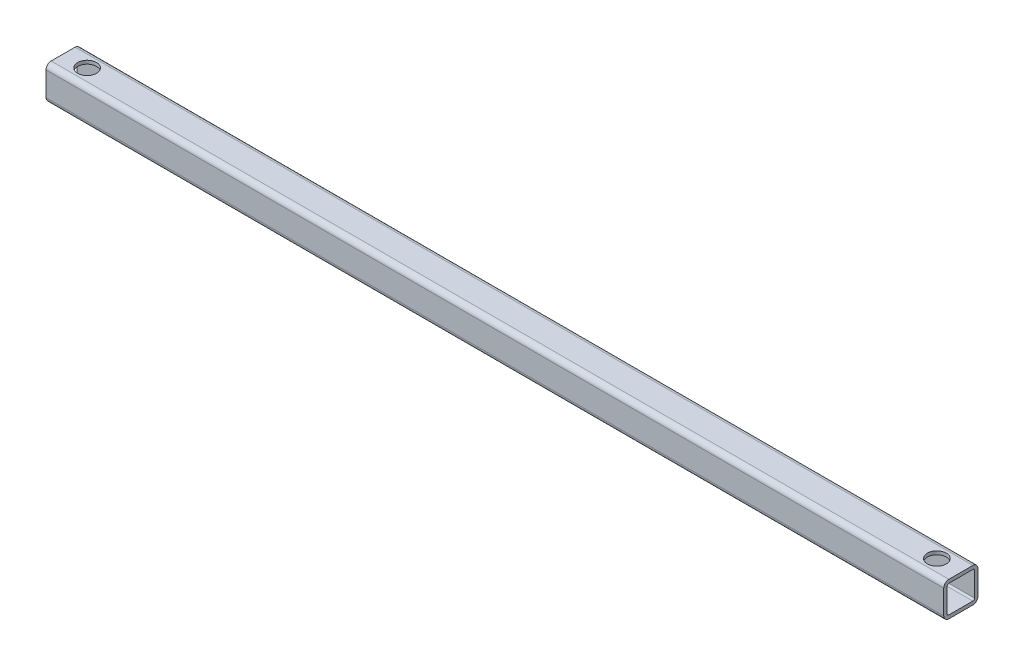
ISO-10303-21;
HEADER;
FILE_DESCRIPTION(('STEP AP214'),'2;1');
FILE_NAME('part.step','',(''),(''),'','','');
FILE_SCHEMA(('AUTOMOTIVE_DESIGN { 1 0 10303 214 1 1 1 1 }'));
ENDSEC;
DATA;
#1=APPLICATION_CONTEXT('core data for automotive mechanical design processes');
#2=APPLICATION_PROTOCOL_DEFINITION('international standard','automotive_design',2000,#1);
#3=PRODUCT_CONTEXT('',#1,'mechanical');
#4=PRODUCT('Part','Part','',(#3));
#5=PRODUCT_RELATED_PRODUCT_CATEGORY('part','',(#4));
#6=PRODUCT_DEFINITION_FORMATION('','',#4);
#7=PRODUCT_DEFINITION_CONTEXT('part definition',#1,'design');
#8=PRODUCT_DEFINITION('design','',#6,#7);
#9=PRODUCT_DEFINITION_SHAPE('','',#8);
#10=(LENGTH_UNIT() NAMED_UNIT(*) SI_UNIT(.MILLI.,.METRE.));
#11=(NAMED_UNIT(*) PLANE_ANGLE_UNIT() SI_UNIT($,.RADIAN.));
#12=(NAMED_UNIT(*) SI_UNIT($,.STERADIAN.) SOLID_ANGLE_UNIT());
#13=UNCERTAINTY_MEASURE_WITH_UNIT(LENGTH_MEASURE(1.E-05),#10,'distance_accuracy_value','');
#14=(GEOMETRIC_REPRESENTATION_CONTEXT(3) GLOBAL_UNCERTAINTY_ASSIGNED_CONTEXT((#13)) GLOBAL_UNIT_ASSIGNED_CONTEXT((#10,
#11,#12)) REPRESENTATION_CONTEXT('',''));
#15=CARTESIAN_POINT('',(0.,0.,0.));
#16=DIRECTION('',(0.,0.,1.));
#17=DIRECTION('',(1.,0.,0.));
#18=AXIS2_PLACEMENT_3D('',#15,#16,#17);
#19=CARTESIAN_POINT('',(262.,7.,7.));
#20=DIRECTION('',(-1.,0.,0.));
#21=DIRECTION('',(0.,0.,1.));
#22=AXIS2_PLACEMENT_3D('',#19,#20,#21);
#23=CYLINDRICAL_SURFACE('',#22,3.);
#24=CARTESIAN_POINT('',(-262.,7.,7.));
#25=DIRECTION('',(1.,0.,0.));
#26=DIRECTION('',(0.,0.,-1.));
#27=AXIS2_PLACEMENT_3D('',#24,#25,#26);
#28=CIRCLE('',#27,3.);
#29=CARTESIAN_POINT('',(-262.,10.,7.));
#30=VERTEX_POINT('',#29);
#31=CARTESIAN_POINT('',(-262.,7.,10.));
#32=VERTEX_POINT('',#31);
#33=EDGE_CURVE('E255',#30,#32,#28,.T.);
#34=ORIENTED_EDGE('',*,*,#33,.T.);
#35=DIRECTION('',(-1.,0.,0.));
#36=VECTOR('',#35,1.);
#37=CARTESIAN_POINT('',(262.,7.,10.));
#38=LINE('',#37,#36);
#39=CARTESIAN_POINT('',(262.,7.,10.));
#40=VERTEX_POINT('',#39);
#41=EDGE_CURVE('E12',#40,#32,#38,.T.);
#42=ORIENTED_EDGE('',*,*,#41,.F.);
#43=CARTESIAN_POINT('',(262.,7.,7.));
#44=DIRECTION('',(1.,0.,0.));
#45=DIRECTION('',(0.,0.,-1.));
#46=AXIS2_PLACEMENT_3D('',#43,#44,#45);
#47=CIRCLE('',#46,3.);
#48=CARTESIAN_POINT('',(262.,10.,7.));
#49=VERTEX_POINT('',#48);
#50=EDGE_CURVE('E364',#49,#40,#47,.T.);
#51=ORIENTED_EDGE('',*,*,#50,.F.);
#52=DIRECTION('',(-1.,0.,0.));
#53=VECTOR('',#52,1.);
#54=CARTESIAN_POINT('',(262.,10.,7.));
#55=LINE('',#54,#53);
#56=EDGE_CURVE('E278',#49,#30,#55,.T.);
#57=ORIENTED_EDGE('',*,*,#56,.T.);
#58=EDGE_LOOP('',(#34,#42,#51,#57));
#59=FACE_BOUND('',#58,.T.);
#60=ADVANCED_FACE('F68',(#59),#23,.T.);
#61=CARTESIAN_POINT('',(262.,7.,10.));
#62=DIRECTION('',(0.,0.,-1.));
#63=DIRECTION('',(-1.,0.,0.));
#64=AXIS2_PLACEMENT_3D('',#61,#62,#63);
#65=PLANE('',#64);
#66=DIRECTION('',(0.,-1.,0.));
#67=VECTOR('',#66,1.);
#68=CARTESIAN_POINT('',(-262.,7.,10.));
#69=LINE('',#68,#67);
#70=CARTESIAN_POINT('',(-262.,-7.,10.));
#71=VERTEX_POINT('',#70);
#72=EDGE_CURVE('E259',#32,#71,#69,.T.);
#73=ORIENTED_EDGE('',*,*,#72,.T.);
#74=DIRECTION('',(-1.,0.,0.));
#75=VECTOR('',#74,1.);
#76=CARTESIAN_POINT('',(262.,-7.,10.));
#77=LINE('',#76,#75);
#78=CARTESIAN_POINT('',(262.,-7.,10.));
#79=VERTEX_POINT('',#78);
#80=EDGE_CURVE('E79',#79,#71,#77,.T.);
#81=ORIENTED_EDGE('',*,*,#80,.F.);
#82=DIRECTION('',(0.,-1.,0.));
#83=VECTOR('',#82,1.);
#84=CARTESIAN_POINT('',(262.,7.,10.));
#85=LINE('',#84,#83);
#86=EDGE_CURVE('E367',#40,#79,#85,.T.);
#87=ORIENTED_EDGE('',*,*,#86,.F.);
#88=ORIENTED_EDGE('',*,*,#41,.T.);
#89=EDGE_LOOP('',(#73,#81,#87,#88));
#90=FACE_BOUND('',#89,.T.);
#91=ADVANCED_FACE('F419',(#90),#65,.F.);
#92=CARTESIAN_POINT('',(262.,-7.,7.));
#93=DIRECTION('',(-1.,0.,0.));
#94=DIRECTION('',(0.,0.,1.));
#95=AXIS2_PLACEMENT_3D('',#92,#93,#94);
#96=CYLINDRICAL_SURFACE('',#95,3.);
#97=CARTESIAN_POINT('',(-262.,-7.,7.));
#98=DIRECTION('',(1.,0.,0.));
#99=DIRECTION('',(0.,0.,-1.));
#100=AXIS2_PLACEMENT_3D('',#97,#98,#99);
#101=CIRCLE('',#100,3.);
#102=CARTESIAN_POINT('',(-262.,-10.,7.));
#103=VERTEX_POINT('',#102);
#104=EDGE_CURVE('E262',#71,#103,#101,.T.);
#105=ORIENTED_EDGE('',*,*,#104,.T.);
#106=DIRECTION('',(-1.,0.,0.));
#107=VECTOR('',#106,1.);
#108=CARTESIAN_POINT('',(262.,-10.,7.));
#109=LINE('',#108,#107);
#110=CARTESIAN_POINT('',(262.,-10.,7.));
#111=VERTEX_POINT('',#110);
#112=EDGE_CURVE('E289',#111,#103,#109,.T.);
#113=ORIENTED_EDGE('',*,*,#112,.F.);
#114=CARTESIAN_POINT('',(262.,-7.,7.));
#115=DIRECTION('',(1.,0.,0.));
#116=DIRECTION('',(0.,0.,-1.));
#117=AXIS2_PLACEMENT_3D('',#114,#115,#116);
#118=CIRCLE('',#117,3.);
#119=EDGE_CURVE('E370',#79,#111,#118,.T.);
#120=ORIENTED_EDGE('',*,*,#119,.F.);
#121=ORIENTED_EDGE('',*,*,#80,.T.);
#122=EDGE_LOOP('',(#105,#113,#120,#121));
#123=FACE_BOUND('',#122,.T.);
#124=ADVANCED_FACE('F424',(#123),#96,.T.);
#125=CARTESIAN_POINT('',(262.,-10.,-7.));
#126=DIRECTION('',(0.,1.,0.));
#127=DIRECTION('',(0.,0.,1.));
#128=AXIS2_PLACEMENT_3D('',#125,#126,#127);
#129=PLANE('',#128);
#130=CARTESIAN_POINT('',(-248.,-10.,0.));
#131=DIRECTION('',(0.,1.,0.));
#132=DIRECTION('',(0.,0.,1.));
#133=AXIS2_PLACEMENT_3D('',#130,#131,#132);
#134=CIRCLE('',#133,2.50000000000002);
#135=CARTESIAN_POINT('',(-248.,-10.,2.50000000000002));
#136=VERTEX_POINT('',#135);
#137=EDGE_CURVE('E685',#136,#136,#134,.T.);
#138=ORIENTED_EDGE('',*,*,#137,.T.);
#139=EDGE_LOOP('',(#138));
#140=FACE_BOUND('',#139,.T.);
#141=CARTESIAN_POINT('',(248.,-10.,0.));
#142=DIRECTION('',(0.,1.,0.));
#143=DIRECTION('',(0.,0.,1.));
#144=AXIS2_PLACEMENT_3D('',#141,#142,#143);
#145=CIRCLE('',#144,2.50000000000002);
#146=CARTESIAN_POINT('',(248.,-10.,2.49999999999996));
#147=VERTEX_POINT('',#146);
#148=EDGE_CURVE('E690',#147,#147,#145,.T.);
#149=ORIENTED_EDGE('',*,*,#148,.T.);
#150=EDGE_LOOP('',(#149));
#151=FACE_BOUND('',#150,.T.);
#152=DIRECTION('',(0.,0.,-1.));
#153=VECTOR('',#152,1.);
#154=CARTESIAN_POINT('',(-262.,-10.,-7.));
#155=LINE('',#154,#153);
#156=CARTESIAN_POINT('',(-262.,-10.,-7.));
#157=VERTEX_POINT('',#156);
#158=EDGE_CURVE('E265',#103,#157,#155,.T.);
#159=ORIENTED_EDGE('',*,*,#158,.T.);
#160=DIRECTION('',(-1.,0.,0.));
#161=VECTOR('',#160,1.);
#162=CARTESIAN_POINT('',(262.,-10.,-7.));
#163=LINE('',#162,#161);
#164=CARTESIAN_POINT('',(262.,-10.,-7.));
#165=VERTEX_POINT('',#164);
#166=EDGE_CURVE('E285',#165,#157,#163,.T.);
#167=ORIENTED_EDGE('',*,*,#166,.F.);
#168=DIRECTION('',(0.,0.,-1.));
#169=VECTOR('',#168,1.);
#170=CARTESIAN_POINT('',(262.,-10.,-7.));
#171=LINE('',#170,#169);
#172=EDGE_CURVE('E373',#111,#165,#171,.T.);
#173=ORIENTED_EDGE('',*,*,#172,.F.);
#174=ORIENTED_EDGE('',*,*,#112,.T.);
#175=EDGE_LOOP('',(#159,#167,#173,#174));
#176=FACE_BOUND('',#175,.T.);
#177=ADVANCED_FACE('F391',(#140,#151,#176),#129,.F.);
#178=CARTESIAN_POINT('',(262.,-7.,-7.));
#179=DIRECTION('',(-1.,0.,0.));
#180=DIRECTION('',(0.,0.,1.));
#181=AXIS2_PLACEMENT_3D('',#178,#179,#180);
#182=CYLINDRICAL_SURFACE('',#181,3.);
#183=CARTESIAN_POINT('',(-262.,-7.,-7.));
#184=DIRECTION('',(1.,0.,0.));
#185=DIRECTION('',(0.,0.,-1.));
#186=AXIS2_PLACEMENT_3D('',#183,#184,#185);
#187=CIRCLE('',#186,3.);
#188=CARTESIAN_POINT('',(-262.,-7.,-10.));
#189=VERTEX_POINT('',#188);
#190=EDGE_CURVE('E268',#157,#189,#187,.T.);
#191=ORIENTED_EDGE('',*,*,#190,.T.);
#192=DIRECTION('',(-1.,0.,0.));
#193=VECTOR('',#192,1.);
#194=CARTESIAN_POINT('',(262.,-7.,-10.));
#195=LINE('',#194,#193);
#196=CARTESIAN_POINT('',(262.,-7.,-10.));
#197=VERTEX_POINT('',#196);
#198=EDGE_CURVE('E210',#197,#189,#195,.T.);
#199=ORIENTED_EDGE('',*,*,#198,.F.);
#200=CARTESIAN_POINT('',(262.,-7.,-7.));
#201=DIRECTION('',(1.,0.,0.));
#202=DIRECTION('',(0.,0.,-1.));
#203=AXIS2_PLACEMENT_3D('',#200,#201,#202);
#204=CIRCLE('',#203,3.);
#205=EDGE_CURVE('E199',#165,#197,#204,.T.);
#206=ORIENTED_EDGE('',*,*,#205,.F.);
#207=ORIENTED_EDGE('',*,*,#166,.T.);
#208=EDGE_LOOP('',(#191,#199,#206,#207));
#209=FACE_BOUND('',#208,.T.);
#210=ADVANCED_FACE('F395',(#209),#182,.T.);
#211=CARTESIAN_POINT('',(262.,-7.,-10.));
#212=DIRECTION('',(0.,0.,1.));
#213=DIRECTION('',(1.,0.,0.));
#214=AXIS2_PLACEMENT_3D('',#211,#212,#213);
#215=PLANE('',#214);
#216=DIRECTION('',(0.,1.,0.));
#217=VECTOR('',#216,1.);
#218=CARTESIAN_POINT('',(-262.,-7.,-10.));
#219=LINE('',#218,#217);
#220=CARTESIAN_POINT('',(-262.,7.,-10.));
#221=VERTEX_POINT('',#220);
#222=EDGE_CURVE('E208',#189,#221,#219,.T.);
#223=ORIENTED_EDGE('',*,*,#222,.T.);
#224=DIRECTION('',(-1.,0.,0.));
#225=VECTOR('',#224,1.);
#226=CARTESIAN_POINT('',(262.,7.,-10.));
#227=LINE('',#226,#225);
#228=CARTESIAN_POINT('',(262.,7.,-10.));
#229=VERTEX_POINT('',#228);
#230=EDGE_CURVE('E205',#229,#221,#227,.T.);
#231=ORIENTED_EDGE('',*,*,#230,.F.);
#232=DIRECTION('',(0.,1.,0.));
#233=VECTOR('',#232,1.);
#234=CARTESIAN_POINT('',(262.,-7.,-10.));
#235=LINE('',#234,#233);
#236=EDGE_CURVE('E193',#197,#229,#235,.T.);
#237=ORIENTED_EDGE('',*,*,#236,.F.);
#238=ORIENTED_EDGE('',*,*,#198,.T.);
#239=EDGE_LOOP('',(#223,#231,#237,#238));
#240=FACE_BOUND('',#239,.T.);
#241=ADVANCED_FACE('F206',(#240),#215,.F.);
#242=CARTESIAN_POINT('',(262.,7.,-7.));
#243=DIRECTION('',(-1.,0.,0.));
#244=DIRECTION('',(0.,0.,1.));
#245=AXIS2_PLACEMENT_3D('',#242,#243,#244);
#246=CYLINDRICAL_SURFACE('',#245,3.);
#247=CARTESIAN_POINT('',(-262.,7.,-7.));
#248=DIRECTION('',(1.,0.,0.));
#249=DIRECTION('',(0.,0.,-1.));
#250=AXIS2_PLACEMENT_3D('',#247,#248,#249);
#251=CIRCLE('',#250,3.);
#252=CARTESIAN_POINT('',(-262.,10.,-7.));
#253=VERTEX_POINT('',#252);
#254=EDGE_CURVE('E141',#221,#253,#251,.T.);
#255=ORIENTED_EDGE('',*,*,#254,.T.);
#256=DIRECTION('',(-1.,0.,0.));
#257=VECTOR('',#256,1.);
#258=CARTESIAN_POINT('',(262.,10.,-7.));
#259=LINE('',#258,#257);
#260=CARTESIAN_POINT('',(262.,10.,-7.));
#261=VERTEX_POINT('',#260);
#262=EDGE_CURVE('E211',#261,#253,#259,.T.);
#263=ORIENTED_EDGE('',*,*,#262,.F.);
#264=CARTESIAN_POINT('',(262.,7.,-7.));
#265=DIRECTION('',(1.,0.,0.));
#266=DIRECTION('',(0.,0.,-1.));
#267=AXIS2_PLACEMENT_3D('',#264,#265,#266);
#268=CIRCLE('',#267,3.);
#269=EDGE_CURVE('E197',#229,#261,#268,.T.);
#270=ORIENTED_EDGE('',*,*,#269,.F.);
#271=ORIENTED_EDGE('',*,*,#230,.T.);
#272=EDGE_LOOP('',(#255,#263,#270,#271));
#273=FACE_BOUND('',#272,.T.);
#274=ADVANCED_FACE('F213',(#273),#246,.T.);
#275=CARTESIAN_POINT('',(262.,-7.,7.));
#276=DIRECTION('',(-1.,0.,0.));
#277=DIRECTION('',(0.,0.,1.));
#278=AXIS2_PLACEMENT_3D('',#275,#276,#277);
#279=CYLINDRICAL_SURFACE('',#278,1.);
#280=CARTESIAN_POINT('',(-262.,-7.,7.));
#281=DIRECTION('',(1.,0.,0.));
#282=DIRECTION('',(0.,0.,-1.));
#283=AXIS2_PLACEMENT_3D('',#280,#281,#282);
#284=CIRCLE('',#283,1.);
#285=CARTESIAN_POINT('',(-262.,-7.,8.));
#286=VERTEX_POINT('',#285);
#287=CARTESIAN_POINT('',(-262.,-8.,7.));
#288=VERTEX_POINT('',#287);
#289=EDGE_CURVE('E222',#286,#288,#284,.T.);
#290=ORIENTED_EDGE('',*,*,#289,.F.);
#291=DIRECTION('',(-1.,0.,0.));
#292=VECTOR('',#291,1.);
#293=CARTESIAN_POINT('',(262.,-7.,8.));
#294=LINE('',#293,#292);
#295=CARTESIAN_POINT('',(262.,-7.,8.));
#296=VERTEX_POINT('',#295);
#297=EDGE_CURVE('E72',#296,#286,#294,.T.);
#298=ORIENTED_EDGE('',*,*,#297,.F.);
#299=CARTESIAN_POINT('',(262.,-7.,7.));
#300=DIRECTION('',(1.,0.,0.));
#301=DIRECTION('',(0.,0.,-1.));
#302=AXIS2_PLACEMENT_3D('',#299,#300,#301);
#303=CIRCLE('',#302,1.);
#304=CARTESIAN_POINT('',(262.,-8.,7.));
#305=VERTEX_POINT('',#304);
#306=EDGE_CURVE('E277',#296,#305,#303,.T.);
#307=ORIENTED_EDGE('',*,*,#306,.T.);
#308=DIRECTION('',(-1.,0.,0.));
#309=VECTOR('',#308,1.);
#310=CARTESIAN_POINT('',(262.,-8.,7.));
#311=LINE('',#310,#309);
#312=EDGE_CURVE('E218',#305,#288,#311,.T.);
#313=ORIENTED_EDGE('',*,*,#312,.T.);
#314=EDGE_LOOP('',(#290,#298,#307,#313));
#315=FACE_BOUND('',#314,.T.);
#316=ADVANCED_FACE('F70',(#315),#279,.F.);
#317=CARTESIAN_POINT('',(262.,7.,8.));
#318=DIRECTION('',(0.,0.,-1.));
#319=DIRECTION('',(-1.,0.,0.));
#320=AXIS2_PLACEMENT_3D('',#317,#318,#319);
#321=PLANE('',#320);
#322=DIRECTION('',(0.,-1.,0.));
#323=VECTOR('',#322,1.);
#324=CARTESIAN_POINT('',(-262.,7.,8.));
#325=LINE('',#324,#323);
#326=CARTESIAN_POINT('',(-262.,7.,8.));
#327=VERTEX_POINT('',#326);
#328=EDGE_CURVE('E226',#327,#286,#325,.T.);
#329=ORIENTED_EDGE('',*,*,#328,.F.);
#330=DIRECTION('',(-1.,0.,0.));
#331=VECTOR('',#330,1.);
#332=CARTESIAN_POINT('',(262.,7.,8.));
#333=LINE('',#332,#331);
#334=CARTESIAN_POINT('',(262.,7.,8.));
#335=VERTEX_POINT('',#334);
#336=EDGE_CURVE('E312',#335,#327,#333,.T.);
#337=ORIENTED_EDGE('',*,*,#336,.F.);
#338=DIRECTION('',(0.,-1.,0.));
#339=VECTOR('',#338,1.);
#340=CARTESIAN_POINT('',(262.,7.,8.));
#341=LINE('',#340,#339);
#342=EDGE_CURVE('E325',#335,#296,#341,.T.);
#343=ORIENTED_EDGE('',*,*,#342,.T.);
#344=ORIENTED_EDGE('',*,*,#297,.T.);
#345=EDGE_LOOP('',(#329,#337,#343,#344));
#346=FACE_BOUND('',#345,.T.);
#347=ADVANCED_FACE('F323',(#346),#321,.T.);
#348=CARTESIAN_POINT('',(262.,7.,7.));
#349=DIRECTION('',(-1.,0.,0.));
#350=DIRECTION('',(0.,0.,1.));
#351=AXIS2_PLACEMENT_3D('',#348,#349,#350);
#352=CYLINDRICAL_SURFACE('',#351,1.);
#353=CARTESIAN_POINT('',(-262.,7.,7.));
#354=DIRECTION('',(1.,0.,0.));
#355=DIRECTION('',(0.,0.,-1.));
#356=AXIS2_PLACEMENT_3D('',#353,#354,#355);
#357=CIRCLE('',#356,1.);
#358=CARTESIAN_POINT('',(-262.,8.,7.));
#359=VERTEX_POINT('',#358);
#360=EDGE_CURVE('E231',#359,#327,#357,.T.);
#361=ORIENTED_EDGE('',*,*,#360,.F.);
#362=DIRECTION('',(-1.,0.,0.));
#363=VECTOR('',#362,1.);
#364=CARTESIAN_POINT('',(262.,8.,7.));
#365=LINE('',#364,#363);
#366=CARTESIAN_POINT('',(262.,8.,7.));
#367=VERTEX_POINT('',#366);
#368=EDGE_CURVE('E310',#367,#359,#365,.T.);
#369=ORIENTED_EDGE('',*,*,#368,.F.);
#370=CARTESIAN_POINT('',(262.,7.,7.));
#371=DIRECTION('',(1.,0.,0.));
#372=DIRECTION('',(0.,0.,-1.));
#373=AXIS2_PLACEMENT_3D('',#370,#371,#372);
#374=CIRCLE('',#373,1.);
#375=EDGE_CURVE('E333',#367,#335,#374,.T.);
#376=ORIENTED_EDGE('',*,*,#375,.T.);
#377=ORIENTED_EDGE('',*,*,#336,.T.);
#378=EDGE_LOOP('',(#361,#369,#376,#377));
#379=FACE_BOUND('',#378,.T.);
#380=ADVANCED_FACE('F331',(#379),#352,.F.);
#381=CARTESIAN_POINT('',(262.,8.,7.));
#382=DIRECTION('',(0.,-1.,0.));
#383=DIRECTION('',(0.,0.,-1.));
#384=AXIS2_PLACEMENT_3D('',#381,#382,#383);
#385=PLANE('',#384);
#386=CARTESIAN_POINT('',(-248.,8.,0.));
#387=DIRECTION('',(0.,-1.,0.));
#388=DIRECTION('',(0.,0.,-1.));
#389=AXIS2_PLACEMENT_3D('',#386,#387,#388);
#390=CIRCLE('',#389,5.50000000000002);
#391=CARTESIAN_POINT('',(-248.,8.,5.50000000000002));
#392=VERTEX_POINT('',#391);
#393=EDGE_CURVE('E704',#392,#392,#390,.F.);
#394=ORIENTED_EDGE('',*,*,#393,.T.);
#395=EDGE_LOOP('',(#394));
#396=FACE_BOUND('',#395,.T.);
#397=CARTESIAN_POINT('',(248.,8.,0.));
#398=DIRECTION('',(0.,-1.,0.));
#399=DIRECTION('',(0.,0.,-1.));
#400=AXIS2_PLACEMENT_3D('',#397,#398,#399);
#401=CIRCLE('',#400,5.50000000000002);
#402=CARTESIAN_POINT('',(248.,8.,5.49999999999996));
#403=VERTEX_POINT('',#402);
#404=EDGE_CURVE('E695',#403,#403,#401,.F.);
#405=ORIENTED_EDGE('',*,*,#404,.T.);
#406=EDGE_LOOP('',(#405));
#407=FACE_BOUND('',#406,.T.);
#408=DIRECTION('',(0.,0.,1.));
#409=VECTOR('',#408,1.);
#410=CARTESIAN_POINT('',(-262.,8.,7.));
#411=LINE('',#410,#409);
#412=CARTESIAN_POINT('',(-262.,8.,-7.));
#413=VERTEX_POINT('',#412);
#414=EDGE_CURVE('E235',#413,#359,#411,.T.);
#415=ORIENTED_EDGE('',*,*,#414,.F.);
#416=DIRECTION('',(-1.,0.,0.));
#417=VECTOR('',#416,1.);
#418=CARTESIAN_POINT('',(262.,8.,-7.));
#419=LINE('',#418,#417);
#420=CARTESIAN_POINT('',(262.,8.,-7.));
#421=VERTEX_POINT('',#420);
#422=EDGE_CURVE('E307',#421,#413,#419,.T.);
#423=ORIENTED_EDGE('',*,*,#422,.F.);
#424=DIRECTION('',(0.,0.,1.));
#425=VECTOR('',#424,1.);
#426=CARTESIAN_POINT('',(262.,8.,7.));
#427=LINE('',#426,#425);
#428=EDGE_CURVE('E339',#421,#367,#427,.T.);
#429=ORIENTED_EDGE('',*,*,#428,.T.);
#430=ORIENTED_EDGE('',*,*,#368,.T.);
#431=EDGE_LOOP('',(#415,#423,#429,#430));
#432=FACE_BOUND('',#431,.T.);
#433=ADVANCED_FACE('F343',(#396,#407,#432),#385,.T.);
#434=CARTESIAN_POINT('',(262.,7.,-7.));
#435=DIRECTION('',(-1.,0.,0.));
#436=DIRECTION('',(0.,0.,1.));
#437=AXIS2_PLACEMENT_3D('',#434,#435,#436);
#438=CYLINDRICAL_SURFACE('',#437,1.);
#439=CARTESIAN_POINT('',(-262.,7.,-7.));
#440=DIRECTION('',(1.,0.,0.));
#441=DIRECTION('',(0.,0.,-1.));
#442=AXIS2_PLACEMENT_3D('',#439,#440,#441);
#443=CIRCLE('',#442,1.);
#444=CARTESIAN_POINT('',(-262.,7.,-8.));
#445=VERTEX_POINT('',#444);
#446=EDGE_CURVE('E239',#445,#413,#443,.T.);
#447=ORIENTED_EDGE('',*,*,#446,.F.);
#448=DIRECTION('',(-1.,0.,0.));
#449=VECTOR('',#448,1.);
#450=CARTESIAN_POINT('',(262.,7.,-8.));
#451=LINE('',#450,#449);
#452=CARTESIAN_POINT('',(262.,7.,-8.));
#453=VERTEX_POINT('',#452);
#454=EDGE_CURVE('E304',#453,#445,#451,.T.);
#455=ORIENTED_EDGE('',*,*,#454,.F.);
#456=CARTESIAN_POINT('',(262.,7.,-7.));
#457=DIRECTION('',(1.,0.,0.));
#458=DIRECTION('',(0.,0.,-1.));
#459=AXIS2_PLACEMENT_3D('',#456,#457,#458);
#460=CIRCLE('',#459,1.);
#461=EDGE_CURVE('E345',#453,#421,#460,.T.);
#462=ORIENTED_EDGE('',*,*,#461,.T.);
#463=ORIENTED_EDGE('',*,*,#422,.T.);
#464=EDGE_LOOP('',(#447,#455,#462,#463));
#465=FACE_BOUND('',#464,.T.);
#466=ADVANCED_FACE('F435',(#465),#438,.F.);
#467=CARTESIAN_POINT('',(262.,-7.,-8.));
#468=DIRECTION('',(0.,0.,1.));
#469=DIRECTION('',(1.,0.,0.));
#470=AXIS2_PLACEMENT_3D('',#467,#468,#469);
#471=PLANE('',#470);
#472=DIRECTION('',(0.,1.,0.));
#473=VECTOR('',#472,1.);
#474=CARTESIAN_POINT('',(-262.,-7.,-8.));
#475=LINE('',#474,#473);
#476=CARTESIAN_POINT('',(-262.,-7.,-8.));
#477=VERTEX_POINT('',#476);
#478=EDGE_CURVE('E243',#477,#445,#475,.T.);
#479=ORIENTED_EDGE('',*,*,#478,.F.);
#480=DIRECTION('',(-1.,0.,0.));
#481=VECTOR('',#480,1.);
#482=CARTESIAN_POINT('',(262.,-7.,-8.));
#483=LINE('',#482,#481);
#484=CARTESIAN_POINT('',(262.,-7.,-8.));
#485=VERTEX_POINT('',#484);
#486=EDGE_CURVE('E301',#485,#477,#483,.T.);
#487=ORIENTED_EDGE('',*,*,#486,.F.);
#488=DIRECTION('',(0.,1.,0.));
#489=VECTOR('',#488,1.);
#490=CARTESIAN_POINT('',(262.,-7.,-8.));
#491=LINE('',#490,#489);
#492=EDGE_CURVE('E349',#485,#453,#491,.T.);
#493=ORIENTED_EDGE('',*,*,#492,.T.);
#494=ORIENTED_EDGE('',*,*,#454,.T.);
#495=EDGE_LOOP('',(#479,#487,#493,#494));
#496=FACE_BOUND('',#495,.T.);
#497=ADVANCED_FACE('F431',(#496),#471,.T.);
#498=CARTESIAN_POINT('',(262.,-7.,-7.));
#499=DIRECTION('',(-1.,0.,0.));
#500=DIRECTION('',(0.,0.,1.));
#501=AXIS2_PLACEMENT_3D('',#498,#499,#500);
#502=CYLINDRICAL_SURFACE('',#501,1.);
#503=CARTESIAN_POINT('',(-262.,-7.,-7.));
#504=DIRECTION('',(1.,0.,0.));
#505=DIRECTION('',(0.,0.,-1.));
#506=AXIS2_PLACEMENT_3D('',#503,#504,#505);
#507=CIRCLE('',#506,1.);
#508=CARTESIAN_POINT('',(-262.,-8.,-7.));
#509=VERTEX_POINT('',#508);
#510=EDGE_CURVE('E247',#509,#477,#507,.T.);
#511=ORIENTED_EDGE('',*,*,#510,.F.);
#512=DIRECTION('',(-1.,0.,0.));
#513=VECTOR('',#512,1.);
#514=CARTESIAN_POINT('',(262.,-8.,-7.));
#515=LINE('',#514,#513);
#516=CARTESIAN_POINT('',(262.,-8.,-7.));
#517=VERTEX_POINT('',#516);
#518=EDGE_CURVE('E298',#517,#509,#515,.T.);
#519=ORIENTED_EDGE('',*,*,#518,.F.);
#520=CARTESIAN_POINT('',(262.,-7.,-7.));
#521=DIRECTION('',(1.,0.,0.));
#522=DIRECTION('',(0.,0.,-1.));
#523=AXIS2_PLACEMENT_3D('',#520,#521,#522);
#524=CIRCLE('',#523,1.);
#525=EDGE_CURVE('E356',#517,#485,#524,.T.);
#526=ORIENTED_EDGE('',*,*,#525,.T.);
#527=ORIENTED_EDGE('',*,*,#486,.T.);
#528=EDGE_LOOP('',(#511,#519,#526,#527));
#529=FACE_BOUND('',#528,.T.);
#530=ADVANCED_FACE('F411',(#529),#502,.F.);
#531=CARTESIAN_POINT('',(262.,-8.,-7.));
#532=DIRECTION('',(0.,1.,0.));
#533=DIRECTION('',(0.,0.,1.));
#534=AXIS2_PLACEMENT_3D('',#531,#532,#533);
#535=PLANE('',#534);
#536=CARTESIAN_POINT('',(-248.,-8.,0.));
#537=DIRECTION('',(0.,1.,0.));
#538=DIRECTION('',(0.,0.,1.));
#539=AXIS2_PLACEMENT_3D('',#536,#537,#538);
#540=CIRCLE('',#539,2.50000000000002);
#541=CARTESIAN_POINT('',(-248.,-8.,2.50000000000002));
#542=VERTEX_POINT('',#541);
#543=EDGE_CURVE('E688',#542,#542,#540,.T.);
#544=ORIENTED_EDGE('',*,*,#543,.F.);
#545=EDGE_LOOP('',(#544));
#546=FACE_BOUND('',#545,.T.);
#547=CARTESIAN_POINT('',(248.,-8.,0.));
#548=DIRECTION('',(0.,1.,0.));
#549=DIRECTION('',(0.,0.,1.));
#550=AXIS2_PLACEMENT_3D('',#547,#548,#549);
#551=CIRCLE('',#550,2.50000000000002);
#552=CARTESIAN_POINT('',(248.,-8.,2.49999999999996));
#553=VERTEX_POINT('',#552);
#554=EDGE_CURVE('E698',#553,#553,#551,.T.);
#555=ORIENTED_EDGE('',*,*,#554,.F.);
#556=EDGE_LOOP('',(#555));
#557=FACE_BOUND('',#556,.T.);
#558=DIRECTION('',(0.,0.,-1.));
#559=VECTOR('',#558,1.);
#560=CARTESIAN_POINT('',(-262.,-8.,-7.));
#561=LINE('',#560,#559);
#562=EDGE_CURVE('E251',#288,#509,#561,.T.);
#563=ORIENTED_EDGE('',*,*,#562,.F.);
#564=ORIENTED_EDGE('',*,*,#312,.F.);
#565=DIRECTION('',(0.,0.,-1.));
#566=VECTOR('',#565,1.);
#567=CARTESIAN_POINT('',(262.,-8.,-7.));
#568=LINE('',#567,#566);
#569=EDGE_CURVE('E360',#305,#517,#568,.T.);
#570=ORIENTED_EDGE('',*,*,#569,.T.);
#571=ORIENTED_EDGE('',*,*,#518,.T.);
#572=EDGE_LOOP('',(#563,#564,#570,#571));
#573=FACE_BOUND('',#572,.T.);
#574=ADVANCED_FACE('F403',(#546,#557,#573),#535,.T.);
#575=CARTESIAN_POINT('',(262.,10.,7.));
#576=DIRECTION('',(0.,-1.,0.));
#577=DIRECTION('',(0.,0.,-1.));
#578=AXIS2_PLACEMENT_3D('',#575,#576,#577);
#579=PLANE('',#578);
#580=CARTESIAN_POINT('',(-248.,10.,0.));
#581=DIRECTION('',(0.,1.,0.));
#582=DIRECTION('',(0.,0.,1.));
#583=AXIS2_PLACEMENT_3D('',#580,#581,#582);
#584=CIRCLE('',#583,5.50000000000002);
#585=CARTESIAN_POINT('',(-248.,10.,5.50000000000002));
#586=VERTEX_POINT('',#585);
#587=EDGE_CURVE('E227',#586,#586,#584,.T.);
#588=ORIENTED_EDGE('',*,*,#587,.F.);
#589=EDGE_LOOP('',(#588));
#590=FACE_BOUND('',#589,.T.);
#591=CARTESIAN_POINT('',(248.,10.,0.));
#592=DIRECTION('',(0.,1.,0.));
#593=DIRECTION('',(0.,0.,-1.));
#594=AXIS2_PLACEMENT_3D('',#591,#592,#593);
#595=CIRCLE('',#594,5.50000000000002);
#596=CARTESIAN_POINT('',(248.,10.,5.49999999999996));
#597=VERTEX_POINT('',#596);
#598=EDGE_CURVE('E708',#597,#597,#595,.T.);
#599=ORIENTED_EDGE('',*,*,#598,.F.);
#600=EDGE_LOOP('',(#599));
#601=FACE_BOUND('',#600,.T.);
#602=DIRECTION('',(0.,0.,1.));
#603=VECTOR('',#602,1.);
#604=CARTESIAN_POINT('',(-262.,10.,7.));
#605=LINE('',#604,#603);
#606=EDGE_CURVE('E147',#253,#30,#605,.T.);
#607=ORIENTED_EDGE('',*,*,#606,.T.);
#608=ORIENTED_EDGE('',*,*,#56,.F.);
#609=DIRECTION('',(0.,0.,1.));
#610=VECTOR('',#609,1.);
#611=CARTESIAN_POINT('',(262.,10.,7.));
#612=LINE('',#611,#610);
#613=EDGE_CURVE('E88',#261,#49,#612,.T.);
#614=ORIENTED_EDGE('',*,*,#613,.F.);
#615=ORIENTED_EDGE('',*,*,#262,.T.);
#616=EDGE_LOOP('',(#607,#608,#614,#615));
#617=FACE_BOUND('',#616,.T.);
#618=ADVANCED_FACE('F401',(#590,#601,#617),#579,.F.);
#619=CARTESIAN_POINT('',(262.,7.,7.));
#620=DIRECTION('',(1.,0.,0.));
#621=DIRECTION('',(0.,0.,-1.));
#622=AXIS2_PLACEMENT_3D('',#619,#620,#621);
#623=PLANE('',#622);
#624=ORIENTED_EDGE('',*,*,#306,.F.);
#625=ORIENTED_EDGE('',*,*,#342,.F.);
#626=ORIENTED_EDGE('',*,*,#375,.F.);
#627=ORIENTED_EDGE('',*,*,#428,.F.);
#628=ORIENTED_EDGE('',*,*,#461,.F.);
#629=ORIENTED_EDGE('',*,*,#492,.F.);
#630=ORIENTED_EDGE('',*,*,#525,.F.);
#631=ORIENTED_EDGE('',*,*,#569,.F.);
#632=EDGE_LOOP('',(#624,#625,#626,#627,#628,#629,#630,#631));
#633=FACE_BOUND('',#632,.T.);
#634=ORIENTED_EDGE('',*,*,#50,.T.);
#635=ORIENTED_EDGE('',*,*,#86,.T.);
#636=ORIENTED_EDGE('',*,*,#119,.T.);
#637=ORIENTED_EDGE('',*,*,#172,.T.);
#638=ORIENTED_EDGE('',*,*,#205,.T.);
#639=ORIENTED_EDGE('',*,*,#236,.T.);
#640=ORIENTED_EDGE('',*,*,#269,.T.);
#641=ORIENTED_EDGE('',*,*,#613,.T.);
#642=EDGE_LOOP('',(#634,#635,#636,#637,#638,#639,#640,#641));
#643=FACE_BOUND('',#642,.T.);
#644=ADVANCED_FACE('F195',(#633,#643),#623,.T.);
#645=CARTESIAN_POINT('',(-262.,7.,7.));
#646=DIRECTION('',(1.,0.,0.));
#647=DIRECTION('',(0.,0.,-1.));
#648=AXIS2_PLACEMENT_3D('',#645,#646,#647);
#649=PLANE('',#648);
#650=ORIENTED_EDGE('',*,*,#289,.T.);
#651=ORIENTED_EDGE('',*,*,#562,.T.);
#652=ORIENTED_EDGE('',*,*,#510,.T.);
#653=ORIENTED_EDGE('',*,*,#478,.T.);
#654=ORIENTED_EDGE('',*,*,#446,.T.);
#655=ORIENTED_EDGE('',*,*,#414,.T.);
#656=ORIENTED_EDGE('',*,*,#360,.T.);
#657=ORIENTED_EDGE('',*,*,#328,.T.);
#658=EDGE_LOOP('',(#650,#651,#652,#653,#654,#655,#656,#657));
#659=FACE_BOUND('',#658,.T.);
#660=ORIENTED_EDGE('',*,*,#33,.F.);
#661=ORIENTED_EDGE('',*,*,#606,.F.);
#662=ORIENTED_EDGE('',*,*,#254,.F.);
#663=ORIENTED_EDGE('',*,*,#222,.F.);
#664=ORIENTED_EDGE('',*,*,#190,.F.);
#665=ORIENTED_EDGE('',*,*,#158,.F.);
#666=ORIENTED_EDGE('',*,*,#104,.F.);
#667=ORIENTED_EDGE('',*,*,#72,.F.);
#668=EDGE_LOOP('',(#660,#661,#662,#663,#664,#665,#666,#667));
#669=FACE_BOUND('',#668,.T.);
#670=ADVANCED_FACE('F328',(#659,#669),#649,.F.);
#671=CARTESIAN_POINT('',(248.,-10.001,0.));
#672=DIRECTION('',(0.,1.,0.));
#673=DIRECTION('',(0.,0.,1.));
#674=AXIS2_PLACEMENT_3D('',#671,#672,#673);
#675=CYLINDRICAL_SURFACE('',#674,5.50000000000002);
#676=CARTESIAN_POINT('',(248.,8.,5.49999999999996));
#677=CARTESIAN_POINT('',(248.,8.02083333333334,5.49999999999996));
#678=CARTESIAN_POINT('',(248.,8.04166666666667,5.49999999999996));
#679=CARTESIAN_POINT('',(248.,8.08333333333334,5.49999999999996));
#680=CARTESIAN_POINT('',(248.,8.10416666666667,5.49999999999996));
#681=CARTESIAN_POINT('',(248.,8.14583333333334,5.49999999999996));
#682=CARTESIAN_POINT('',(248.,8.16666666666667,5.49999999999996));
#683=CARTESIAN_POINT('',(248.,8.20833333333334,5.49999999999996));
#684=CARTESIAN_POINT('',(248.,8.22916666666667,5.49999999999996));
#685=CARTESIAN_POINT('',(248.,8.27083333333334,5.49999999999996));
#686=CARTESIAN_POINT('',(248.,8.29166666666667,5.49999999999996));
#687=CARTESIAN_POINT('',(248.,8.33333333333334,5.49999999999996));
#688=CARTESIAN_POINT('',(248.,8.35416666666667,5.49999999999996));
#689=CARTESIAN_POINT('',(248.,8.39583333333334,5.49999999999996));
#690=CARTESIAN_POINT('',(248.,8.41666666666667,5.49999999999996));
#691=CARTESIAN_POINT('',(248.,8.45833333333334,5.49999999999996));
#692=CARTESIAN_POINT('',(248.,8.47916666666667,5.49999999999996));
#693=CARTESIAN_POINT('',(248.,8.52083333333334,5.49999999999996));
#694=CARTESIAN_POINT('',(248.,8.54166666666667,5.49999999999996));
#695=CARTESIAN_POINT('',(248.,8.58333333333333,5.49999999999996));
#696=CARTESIAN_POINT('',(248.,8.60416666666667,5.49999999999996));
#697=CARTESIAN_POINT('',(248.,8.64583333333333,5.49999999999996));
#698=CARTESIAN_POINT('',(248.,8.66666666666667,5.49999999999996));
#699=CARTESIAN_POINT('',(248.,8.70833333333333,5.49999999999996));
#700=CARTESIAN_POINT('',(248.,8.72916666666667,5.49999999999996));
#701=CARTESIAN_POINT('',(248.,8.77083333333333,5.49999999999996));
#702=CARTESIAN_POINT('',(248.,8.79166666666667,5.49999999999996));
#703=CARTESIAN_POINT('',(248.,8.83333333333333,5.49999999999996));
#704=CARTESIAN_POINT('',(248.,8.85416666666667,5.49999999999996));
#705=CARTESIAN_POINT('',(248.,8.89583333333333,5.49999999999996));
#706=CARTESIAN_POINT('',(248.,8.91666666666667,5.49999999999996));
#707=CARTESIAN_POINT('',(248.,8.95833333333333,5.49999999999996));
#708=CARTESIAN_POINT('',(248.,8.97916666666667,5.49999999999996));
#709=CARTESIAN_POINT('',(248.,9.02083333333333,5.49999999999996));
#710=CARTESIAN_POINT('',(248.,9.04166666666667,5.49999999999996));
#711=CARTESIAN_POINT('',(248.,9.08333333333333,5.49999999999996));
#712=CARTESIAN_POINT('',(248.,9.10416666666667,5.49999999999996));
#713=CARTESIAN_POINT('',(248.,9.14583333333333,5.49999999999996));
#714=CARTESIAN_POINT('',(248.,9.16666666666667,5.49999999999996));
#715=CARTESIAN_POINT('',(248.,9.20833333333333,5.49999999999996));
#716=CARTESIAN_POINT('',(248.,9.22916666666667,5.49999999999996));
#717=CARTESIAN_POINT('',(248.,9.27083333333333,5.49999999999996));
#718=CARTESIAN_POINT('',(248.,9.29166666666667,5.49999999999996));
#719=CARTESIAN_POINT('',(248.,9.33333333333333,5.49999999999996));
#720=CARTESIAN_POINT('',(248.,9.35416666666667,5.49999999999996));
#721=CARTESIAN_POINT('',(248.,9.39583333333333,5.49999999999996));
#722=CARTESIAN_POINT('',(248.,9.41666666666667,5.49999999999996));
#723=CARTESIAN_POINT('',(248.,9.45833333333333,5.49999999999996));
#724=CARTESIAN_POINT('',(248.,9.47916666666667,5.49999999999996));
#725=CARTESIAN_POINT('',(248.,9.52083333333333,5.49999999999996));
#726=CARTESIAN_POINT('',(248.,9.54166666666667,5.49999999999996));
#727=CARTESIAN_POINT('',(248.,9.58333333333333,5.49999999999996));
#728=CARTESIAN_POINT('',(248.,9.60416666666667,5.49999999999996));
#729=CARTESIAN_POINT('',(248.,9.64583333333333,5.49999999999996));
#730=CARTESIAN_POINT('',(248.,9.66666666666667,5.49999999999996));
#731=CARTESIAN_POINT('',(248.,9.70833333333333,5.49999999999996));
#732=CARTESIAN_POINT('',(248.,9.72916666666667,5.49999999999996));
#733=CARTESIAN_POINT('',(248.,9.77083333333333,5.49999999999996));
#734=CARTESIAN_POINT('',(248.,9.79166666666667,5.49999999999996));
#735=CARTESIAN_POINT('',(248.,9.83333333333333,5.49999999999996));
#736=CARTESIAN_POINT('',(248.,9.85416666666667,5.49999999999996));
#737=CARTESIAN_POINT('',(248.,9.89583333333333,5.49999999999996));
#738=CARTESIAN_POINT('',(248.,9.91666666666667,5.49999999999996));
#739=CARTESIAN_POINT('',(248.,9.95833333333333,5.49999999999996));
#740=CARTESIAN_POINT('',(248.,9.97916666666667,5.49999999999996));
#741=CARTESIAN_POINT('',(248.,10.,5.49999999999996));
#742=B_SPLINE_CURVE_WITH_KNOTS('',3,(#676,#677,#678,#679,#680,#681,#682,#683,#684,#685,#686,
#687,#688,#689,#690,#691,#692,#693,#694,#695,#696,#697,#698,#699,#700,#701,#702,#703,#704,#705,
#706,#707,#708,#709,#710,#711,#712,#713,#714,#715,#716,#717,#718,#719,#720,#721,#722,#723,#724,
#725,#726,#727,#728,#729,#730,#731,#732,#733,#734,#735,#736,#737,#738,#739,#740,#741),
.UNSPECIFIED.,.F.,.F.,(4,2,2,2,2,2,2,2,2,2,2,2,2,2,2,2,2,2,2,2,2,2,2,2,2,2,2,2,2,2,2,2,4),(0.,
0.0625000000000001,0.125,0.1875,0.25,0.3125,0.375,0.4375,0.5,0.562499999999997,
0.624999999999997,0.687499999999997,0.749999999999997,0.812499999999997,0.874999999999997,
0.937499999999997,0.999999999999997,1.0625,1.125,1.1875,1.25,1.3125,1.375,1.4375,
1.49999999999999,1.56249999999999,1.62499999999999,1.68749999999999,1.74999999999999,
1.81249999999999,1.87499999999999,1.93749999999999,1.99999999999999),.UNSPECIFIED.);
#743=EDGE_CURVE('BSEAM548',#403,#597,#742,.T.);
#744=ORIENTED_EDGE('',*,*,#404,.F.);
#745=ORIENTED_EDGE('',*,*,#598,.T.);
#746=ORIENTED_EDGE('',*,*,#743,.T.);
#747=ORIENTED_EDGE('',*,*,#743,.F.);
#748=EDGE_LOOP('',(#744,#746,#745,#747));
#749=FACE_BOUND('',#748,.T.);
#750=ADVANCED_FACE('F548',(#749),#675,.F.);
#751=CARTESIAN_POINT('',(-248.,-10.001,0.));
#752=DIRECTION('',(0.,1.,0.));
#753=DIRECTION('',(0.,0.,1.));
#754=AXIS2_PLACEMENT_3D('',#751,#752,#753);
#755=CYLINDRICAL_SURFACE('',#754,5.50000000000002);
#756=CARTESIAN_POINT('',(-248.,8.,5.50000000000002));
#757=CARTESIAN_POINT('',(-248.,8.02083333333334,5.50000000000002));
#758=CARTESIAN_POINT('',(-248.,8.04166666666667,5.50000000000002));
#759=CARTESIAN_POINT('',(-248.,8.08333333333334,5.50000000000002));
#760=CARTESIAN_POINT('',(-248.,8.10416666666667,5.50000000000002));
#761=CARTESIAN_POINT('',(-248.,8.14583333333334,5.50000000000002));
#762=CARTESIAN_POINT('',(-248.,8.16666666666667,5.50000000000002));
#763=CARTESIAN_POINT('',(-248.,8.20833333333334,5.50000000000002));
#764=CARTESIAN_POINT('',(-248.,8.22916666666667,5.50000000000002));
#765=CARTESIAN_POINT('',(-248.,8.27083333333334,5.50000000000002));
#766=CARTESIAN_POINT('',(-248.,8.29166666666667,5.50000000000002));
#767=CARTESIAN_POINT('',(-248.,8.33333333333334,5.50000000000002));
#768=CARTESIAN_POINT('',(-248.,8.35416666666667,5.50000000000002));
#769=CARTESIAN_POINT('',(-248.,8.39583333333334,5.50000000000002));
#770=CARTESIAN_POINT('',(-248.,8.41666666666667,5.50000000000002));
#771=CARTESIAN_POINT('',(-248.,8.45833333333334,5.50000000000002));
#772=CARTESIAN_POINT('',(-248.,8.47916666666667,5.50000000000002));
#773=CARTESIAN_POINT('',(-248.,8.52083333333334,5.50000000000002));
#774=CARTESIAN_POINT('',(-248.,8.54166666666667,5.50000000000002));
#775=CARTESIAN_POINT('',(-248.,8.58333333333333,5.50000000000002));
#776=CARTESIAN_POINT('',(-248.,8.60416666666667,5.50000000000002));
#777=CARTESIAN_POINT('',(-248.,8.64583333333333,5.50000000000002));
#778=CARTESIAN_POINT('',(-248.,8.66666666666667,5.50000000000002));
#779=CARTESIAN_POINT('',(-248.,8.70833333333333,5.50000000000002));
#780=CARTESIAN_POINT('',(-248.,8.72916666666667,5.50000000000002));
#781=CARTESIAN_POINT('',(-248.,8.77083333333333,5.50000000000002));
#782=CARTESIAN_POINT('',(-248.,8.79166666666667,5.50000000000002));
#783=CARTESIAN_POINT('',(-248.,8.83333333333333,5.50000000000002));
#784=CARTESIAN_POINT('',(-248.,8.85416666666667,5.50000000000002));
#785=CARTESIAN_POINT('',(-248.,8.89583333333333,5.50000000000002));
#786=CARTESIAN_POINT('',(-248.,8.91666666666667,5.50000000000002));
#787=CARTESIAN_POINT('',(-248.,8.95833333333333,5.50000000000002));
#788=CARTESIAN_POINT('',(-248.,8.97916666666667,5.50000000000002));
#789=CARTESIAN_POINT('',(-248.,9.02083333333333,5.50000000000002));
#790=CARTESIAN_POINT('',(-248.,9.04166666666667,5.50000000000002));
#791=CARTESIAN_POINT('',(-248.,9.08333333333333,5.50000000000002));
#792=CARTESIAN_POINT('',(-248.,9.10416666666667,5.50000000000002));
#793=CARTESIAN_POINT('',(-248.,9.14583333333333,5.50000000000002));
#794=CARTESIAN_POINT('',(-248.,9.16666666666667,5.50000000000002));
#795=CARTESIAN_POINT('',(-248.,9.20833333333333,5.50000000000002));
#796=CARTESIAN_POINT('',(-248.,9.22916666666667,5.50000000000002));
#797=CARTESIAN_POINT('',(-248.,9.27083333333333,5.50000000000002));
#798=CARTESIAN_POINT('',(-248.,9.29166666666667,5.50000000000002));
#799=CARTESIAN_POINT('',(-248.,9.33333333333333,5.50000000000002));
#800=CARTESIAN_POINT('',(-248.,9.35416666666667,5.50000000000002));
#801=CARTESIAN_POINT('',(-248.,9.39583333333333,5.50000000000002));
#802=CARTESIAN_POINT('',(-248.,9.41666666666667,5.50000000000002));
#803=CARTESIAN_POINT('',(-248.,9.45833333333333,5.50000000000002));
#804=CARTESIAN_POINT('',(-248.,9.47916666666667,5.50000000000002));
#805=CARTESIAN_POINT('',(-248.,9.52083333333333,5.50000000000002));
#806=CARTESIAN_POINT('',(-248.,9.54166666666667,5.50000000000002));
#807=CARTESIAN_POINT('',(-248.,9.58333333333333,5.50000000000002));
#808=CARTESIAN_POINT('',(-248.,9.60416666666667,5.50000000000002));
#809=CARTESIAN_POINT('',(-248.,9.64583333333333,5.50000000000002));
#810=CARTESIAN_POINT('',(-248.,9.66666666666667,5.50000000000002));
#811=CARTESIAN_POINT('',(-248.,9.70833333333333,5.50000000000002));
#812=CARTESIAN_POINT('',(-248.,9.72916666666667,5.50000000000002));
#813=CARTESIAN_POINT('',(-248.,9.77083333333333,5.50000000000002));
#814=CARTESIAN_POINT('',(-248.,9.79166666666667,5.50000000000002));
#815=CARTESIAN_POINT('',(-248.,9.83333333333333,5.50000000000002));
#816=CARTESIAN_POINT('',(-248.,9.85416666666667,5.50000000000002));
#817=CARTESIAN_POINT('',(-248.,9.89583333333333,5.50000000000002));
#818=CARTESIAN_POINT('',(-248.,9.91666666666667,5.50000000000002));
#819=CARTESIAN_POINT('',(-248.,9.95833333333333,5.50000000000002));
#820=CARTESIAN_POINT('',(-248.,9.97916666666667,5.50000000000002));
#821=CARTESIAN_POINT('',(-248.,10.,5.50000000000002));
#822=B_SPLINE_CURVE_WITH_KNOTS('',3,(#756,#757,#758,#759,#760,#761,#762,#763,#764,#765,#766,
#767,#768,#769,#770,#771,#772,#773,#774,#775,#776,#777,#778,#779,#780,#781,#782,#783,#784,#785,
#786,#787,#788,#789,#790,#791,#792,#793,#794,#795,#796,#797,#798,#799,#800,#801,#802,#803,#804,
#805,#806,#807,#808,#809,#810,#811,#812,#813,#814,#815,#816,#817,#818,#819,#820,#821),
.UNSPECIFIED.,.F.,.F.,(4,2,2,2,2,2,2,2,2,2,2,2,2,2,2,2,2,2,2,2,2,2,2,2,2,2,2,2,2,2,2,2,4),(0.,
0.0625000000000001,0.125,0.1875,0.25,0.3125,0.375,0.4375,0.5,0.562499999999997,
0.624999999999997,0.687499999999997,0.749999999999997,0.812499999999997,0.874999999999997,
0.937499999999997,0.999999999999997,1.0625,1.125,1.1875,1.25,1.3125,1.375,1.4375,
1.49999999999999,1.56249999999999,1.62499999999999,1.68749999999999,1.74999999999999,
1.81249999999999,1.87499999999999,1.93749999999999,1.99999999999999),.UNSPECIFIED.);
#823=EDGE_CURVE('BSEAM555',#392,#586,#822,.T.);
#824=ORIENTED_EDGE('',*,*,#393,.F.);
#825=ORIENTED_EDGE('',*,*,#587,.T.);
#826=ORIENTED_EDGE('',*,*,#823,.T.);
#827=ORIENTED_EDGE('',*,*,#823,.F.);
#828=EDGE_LOOP('',(#824,#826,#825,#827));
#829=FACE_BOUND('',#828,.T.);
#830=ADVANCED_FACE('F555',(#829),#755,.F.);
#831=CARTESIAN_POINT('',(248.,-10.,0.));
#832=DIRECTION('',(0.,1.,0.));
#833=DIRECTION('',(0.,0.,1.));
#834=AXIS2_PLACEMENT_3D('',#831,#832,#833);
#835=CYLINDRICAL_SURFACE('',#834,2.50000000000002);
#836=ORIENTED_EDGE('',*,*,#148,.F.);
#837=EDGE_LOOP('',(#836));
#838=FACE_BOUND('',#837,.T.);
#839=ORIENTED_EDGE('',*,*,#554,.T.);
#840=EDGE_LOOP('',(#839));
#841=FACE_BOUND('',#840,.T.);
#842=ADVANCED_FACE('F565',(#838,#841),#835,.F.);
#843=CARTESIAN_POINT('',(-248.,-10.,0.));
#844=DIRECTION('',(0.,1.,0.));
#845=DIRECTION('',(0.,0.,1.));
#846=AXIS2_PLACEMENT_3D('',#843,#844,#845);
#847=CYLINDRICAL_SURFACE('',#846,2.50000000000002);
#848=ORIENTED_EDGE('',*,*,#137,.F.);
#849=EDGE_LOOP('',(#848));
#850=FACE_BOUND('',#849,.T.);
#851=ORIENTED_EDGE('',*,*,#543,.T.);
#852=EDGE_LOOP('',(#851));
#853=FACE_BOUND('',#852,.T.);
#854=ADVANCED_FACE('F574',(#850,#853),#847,.F.);
#855=CLOSED_SHELL('',(#60,#91,#124,#177,#210,#241,#274,#316,#347,#380,#433,#466,#497,#530,#574,
#618,#644,#670,#750,#830,#842,#854));
#856=MANIFOLD_SOLID_BREP('B2',#855);
#857=ADVANCED_BREP_SHAPE_REPRESENTATION('',(#18,#856),#14);
#858=SHAPE_DEFINITION_REPRESENTATION(#9,#857);
ENDSEC;
END-ISO-10303-21;
